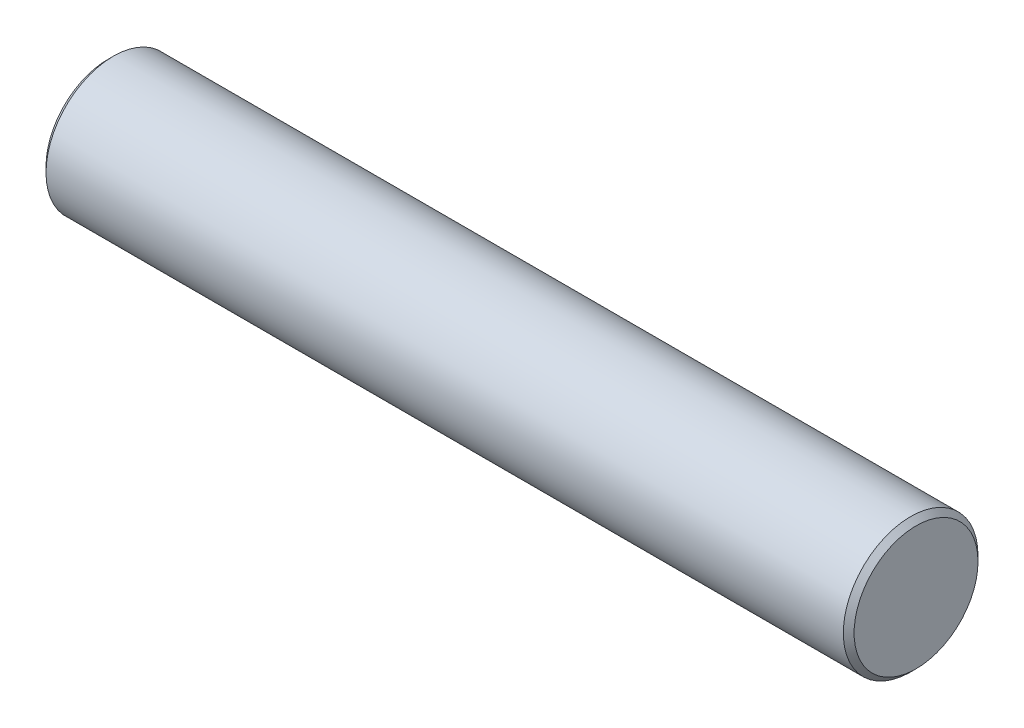
ISO-10303-21;
HEADER;
FILE_DESCRIPTION(('STEP AP214'),'2;1');
FILE_NAME('part.step','',(''),(''),'','','');
FILE_SCHEMA(('AUTOMOTIVE_DESIGN { 1 0 10303 214 1 1 1 1 }'));
ENDSEC;
DATA;
#1=APPLICATION_CONTEXT('core data for automotive mechanical design processes');
#2=APPLICATION_PROTOCOL_DEFINITION('international standard','automotive_design',2000,#1);
#3=PRODUCT_CONTEXT('',#1,'mechanical');
#4=PRODUCT('Part','Part','',(#3));
#5=PRODUCT_RELATED_PRODUCT_CATEGORY('part','',(#4));
#6=PRODUCT_DEFINITION_FORMATION('','',#4);
#7=PRODUCT_DEFINITION_CONTEXT('part definition',#1,'design');
#8=PRODUCT_DEFINITION('design','',#6,#7);
#9=PRODUCT_DEFINITION_SHAPE('','',#8);
#10=(LENGTH_UNIT() NAMED_UNIT(*) SI_UNIT(.MILLI.,.METRE.));
#11=(NAMED_UNIT(*) PLANE_ANGLE_UNIT() SI_UNIT($,.RADIAN.));
#12=(NAMED_UNIT(*) SI_UNIT($,.STERADIAN.) SOLID_ANGLE_UNIT());
#13=UNCERTAINTY_MEASURE_WITH_UNIT(LENGTH_MEASURE(1.E-05),#10,'distance_accuracy_value','');
#14=(GEOMETRIC_REPRESENTATION_CONTEXT(3) GLOBAL_UNCERTAINTY_ASSIGNED_CONTEXT((#13)) GLOBAL_UNIT_ASSIGNED_CONTEXT((#10,
#11,#12)) REPRESENTATION_CONTEXT('',''));
#15=CARTESIAN_POINT('',(0.,0.,0.));
#16=DIRECTION('',(0.,0.,1.));
#17=DIRECTION('',(1.,0.,0.));
#18=AXIS2_PLACEMENT_3D('',#15,#16,#17);
#19=CARTESIAN_POINT('',(0.,0.,0.));
#20=DIRECTION('',(1.,0.,0.));
#21=DIRECTION('',(0.,0.,-1.));
#22=AXIS2_PLACEMENT_3D('',#19,#20,#21);
#23=PLANE('',#22);
#24=CARTESIAN_POINT('',(0.,0.,0.));
#25=DIRECTION('',(1.,0.,0.));
#26=DIRECTION('',(0.,0.,-1.));
#27=AXIS2_PLACEMENT_3D('',#24,#25,#26);
#28=CIRCLE('',#27,2.3);
#29=CARTESIAN_POINT('',(0.,0.,-2.3));
#30=VERTEX_POINT('',#29);
#31=EDGE_CURVE('E52',#30,#30,#28,.T.);
#32=ORIENTED_EDGE('',*,*,#31,.T.);
#33=EDGE_LOOP('',(#32));
#34=FACE_BOUND('',#33,.T.);
#35=ADVANCED_FACE('F36',(#34),#23,.T.);
#36=CARTESIAN_POINT('',(0.,0.,0.));
#37=DIRECTION('',(1.,0.,0.));
#38=DIRECTION('',(0.,0.,-1.));
#39=AXIS2_PLACEMENT_3D('',#36,#37,#38);
#40=CYLINDRICAL_SURFACE('',#39,2.5);
#41=CARTESIAN_POINT('',(-0.2,0.,0.));
#42=DIRECTION('',(1.,0.,0.));
#43=DIRECTION('',(0.,0.,-1.));
#44=AXIS2_PLACEMENT_3D('',#41,#42,#43);
#45=CIRCLE('',#44,2.5);
#46=CARTESIAN_POINT('',(-0.2,0.,-2.5));
#47=VERTEX_POINT('',#46);
#48=EDGE_CURVE('E44',#47,#47,#45,.F.);
#49=ORIENTED_EDGE('',*,*,#48,.T.);
#50=EDGE_LOOP('',(#49));
#51=FACE_BOUND('',#50,.T.);
#52=CARTESIAN_POINT('',(-29.8,0.,0.));
#53=DIRECTION('',(-1.,0.,0.));
#54=DIRECTION('',(0.,0.,1.));
#55=AXIS2_PLACEMENT_3D('',#52,#53,#54);
#56=CIRCLE('',#55,2.5);
#57=CARTESIAN_POINT('',(-29.8,0.,2.5));
#58=VERTEX_POINT('',#57);
#59=EDGE_CURVE('E48',#58,#58,#56,.F.);
#60=ORIENTED_EDGE('',*,*,#59,.T.);
#61=EDGE_LOOP('',(#60));
#62=FACE_BOUND('',#61,.T.);
#63=ADVANCED_FACE('F68',(#51,#62),#40,.T.);
#64=CARTESIAN_POINT('',(-30.,0.,0.));
#65=DIRECTION('',(-1.,0.,0.));
#66=DIRECTION('',(0.,0.,1.));
#67=AXIS2_PLACEMENT_3D('',#64,#65,#66);
#68=PLANE('',#67);
#69=CARTESIAN_POINT('',(-30.,0.,0.));
#70=DIRECTION('',(-1.,0.,0.));
#71=DIRECTION('',(0.,0.,1.));
#72=AXIS2_PLACEMENT_3D('',#69,#70,#71);
#73=CIRCLE('',#72,2.3);
#74=CARTESIAN_POINT('',(-30.,0.,2.3));
#75=VERTEX_POINT('',#74);
#76=EDGE_CURVE('E10',#75,#75,#73,.T.);
#77=ORIENTED_EDGE('',*,*,#76,.T.);
#78=EDGE_LOOP('',(#77));
#79=FACE_BOUND('',#78,.T.);
#80=ADVANCED_FACE('F61',(#79),#68,.T.);
#81=CARTESIAN_POINT('',(0.,0.,0.));
#82=DIRECTION('',(-1.,0.,0.));
#83=DIRECTION('',(0.,0.,1.));
#84=AXIS2_PLACEMENT_3D('',#81,#82,#83);
#85=CONICAL_SURFACE('',#84,2.3,0.785398163397441);
#86=ORIENTED_EDGE('',*,*,#48,.F.);
#87=EDGE_LOOP('',(#86));
#88=FACE_BOUND('',#87,.T.);
#89=ORIENTED_EDGE('',*,*,#31,.F.);
#90=EDGE_LOOP('',(#89));
#91=FACE_BOUND('',#90,.T.);
#92=ADVANCED_FACE('F59',(#88,#91),#85,.T.);
#93=CARTESIAN_POINT('',(-29.8,0.,0.));
#94=DIRECTION('',(1.,0.,0.));
#95=DIRECTION('',(0.,0.,-1.));
#96=AXIS2_PLACEMENT_3D('',#93,#94,#95);
#97=CONICAL_SURFACE('',#96,2.5,0.785398163397453);
#98=ORIENTED_EDGE('',*,*,#76,.F.);
#99=EDGE_LOOP('',(#98));
#100=FACE_BOUND('',#99,.T.);
#101=ORIENTED_EDGE('',*,*,#59,.F.);
#102=EDGE_LOOP('',(#101));
#103=FACE_BOUND('',#102,.T.);
#104=ADVANCED_FACE('F39',(#100,#103),#97,.T.);
#105=CLOSED_SHELL('',(#35,#63,#80,#92,#104));
#106=MANIFOLD_SOLID_BREP('B2',#105);
#107=ADVANCED_BREP_SHAPE_REPRESENTATION('',(#18,#106),#14);
#108=SHAPE_DEFINITION_REPRESENTATION(#9,#107);
ENDSEC;
END-ISO-10303-21;
